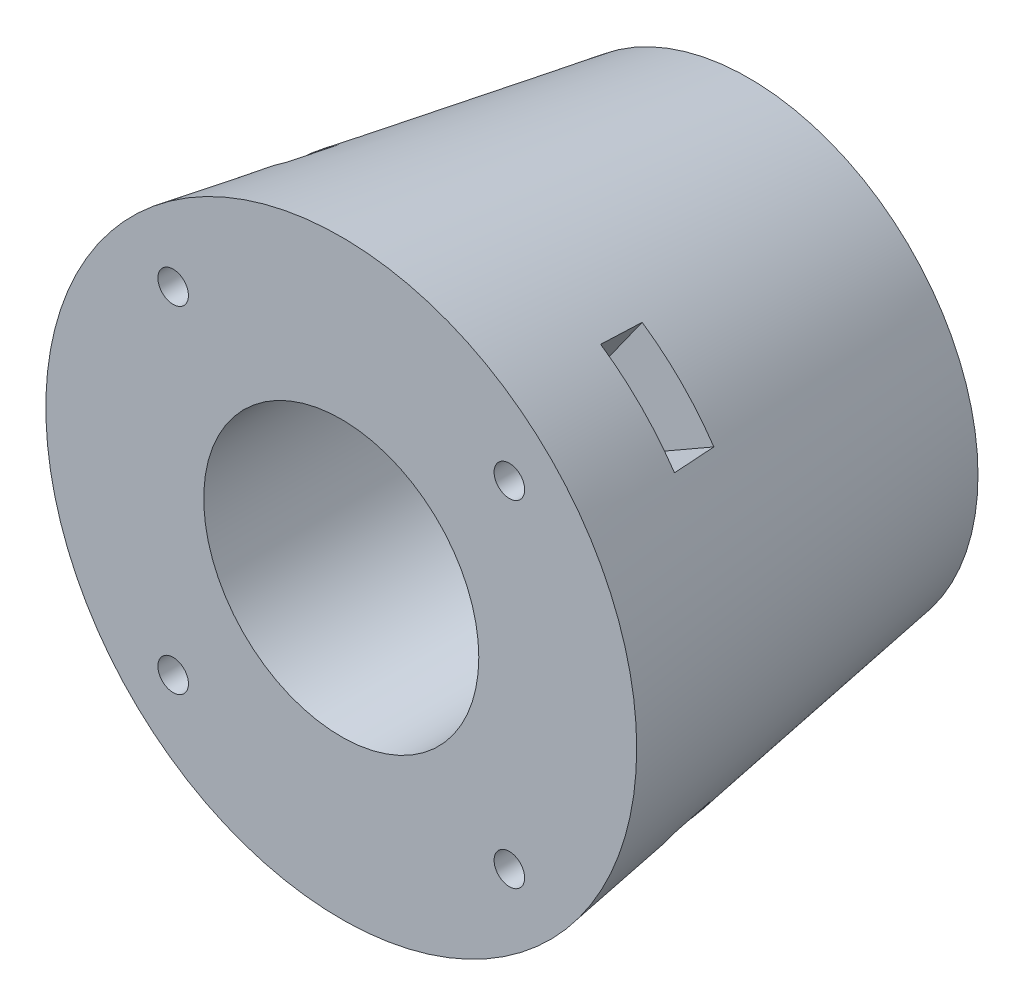
ISO-10303-21;
HEADER;
FILE_DESCRIPTION(('STEP AP214'),'2;1');
FILE_NAME('part.step','',(''),(''),'','','');
FILE_SCHEMA(('AUTOMOTIVE_DESIGN { 1 0 10303 214 1 1 1 1 }'));
ENDSEC;
DATA;
#1=APPLICATION_CONTEXT('core data for automotive mechanical design processes');
#2=APPLICATION_PROTOCOL_DEFINITION('international standard','automotive_design',2000,#1);
#3=PRODUCT_CONTEXT('',#1,'mechanical');
#4=PRODUCT('Part','Part','',(#3));
#5=PRODUCT_RELATED_PRODUCT_CATEGORY('part','',(#4));
#6=PRODUCT_DEFINITION_FORMATION('','',#4);
#7=PRODUCT_DEFINITION_CONTEXT('part definition',#1,'design');
#8=PRODUCT_DEFINITION('design','',#6,#7);
#9=PRODUCT_DEFINITION_SHAPE('','',#8);
#10=(LENGTH_UNIT() NAMED_UNIT(*) SI_UNIT(.MILLI.,.METRE.));
#11=(NAMED_UNIT(*) PLANE_ANGLE_UNIT() SI_UNIT($,.RADIAN.));
#12=(NAMED_UNIT(*) SI_UNIT($,.STERADIAN.) SOLID_ANGLE_UNIT());
#13=UNCERTAINTY_MEASURE_WITH_UNIT(LENGTH_MEASURE(1.E-05),#10,'distance_accuracy_value','');
#14=(GEOMETRIC_REPRESENTATION_CONTEXT(3) GLOBAL_UNCERTAINTY_ASSIGNED_CONTEXT((#13)) GLOBAL_UNIT_ASSIGNED_CONTEXT((#10,
#11,#12)) REPRESENTATION_CONTEXT('',''));
#15=CARTESIAN_POINT('',(0.,0.,0.));
#16=DIRECTION('',(0.,0.,1.));
#17=DIRECTION('',(1.,0.,0.));
#18=AXIS2_PLACEMENT_3D('',#15,#16,#17);
#19=CARTESIAN_POINT('',(0.,0.,0.));
#20=DIRECTION('',(0.,0.,1.));
#21=DIRECTION('',(1.,0.,0.));
#22=AXIS2_PLACEMENT_3D('',#19,#20,#21);
#23=CONICAL_SURFACE('',#22,29.,0.161093889959077);
#24=CARTESIAN_POINT('',(0.,0.,-14.5));
#25=DIRECTION('',(0.,0.,-1.));
#26=DIRECTION('',(-1.,0.,0.));
#27=AXIS2_PLACEMENT_3D('',#24,#25,#26);
#28=CIRCLE('',#27,26.6437204511795);
#29=CARTESIAN_POINT('',(14.9224643569327,-22.0727863441993,-14.5));
#30=VERTEX_POINT('',#29);
#31=CARTESIAN_POINT('',(21.9945592083481,-15.037526548973,-14.5));
#32=VERTEX_POINT('',#31);
#33=EDGE_CURVE('E11',#30,#32,#28,.F.);
#34=ORIENTED_EDGE('',*,*,#33,.F.);
#35=CARTESIAN_POINT('',(15.2873275589754,-22.7087847490646,-9.9998));
#36=CARTESIAN_POINT('',(15.2265185691146,-22.6027877059633,-10.7498680571058));
#37=CARTESIAN_POINT('',(15.1657074559639,-22.4967869617245,-11.4999354189919));
#38=CARTESIAN_POINT('',(15.044080983083,-22.2847780709715,-13.0000687523253));
#39=CARTESIAN_POINT('',(14.9832656233527,-22.1787699244574,-13.7501347237725));
#40=CARTESIAN_POINT('',(14.9224481403327,-22.0727580768057,-14.5002));
#41=B_SPLINE_CURVE_WITH_KNOTS('',3,(#35,#36,#37,#38,#39,#40),.UNSPECIFIED.,.F.,.F.,(4,2,4),(0.,
2.27987209502136,4.55974419004472),.UNSPECIFIED.);
#42=CARTESIAN_POINT('',(15.2873113447005,-22.7087564857238,-10.));
#43=VERTEX_POINT('',#42);
#44=EDGE_CURVE('E164',#43,#30,#41,.T.);
#45=ORIENTED_EDGE('',*,*,#44,.F.);
#46=CARTESIAN_POINT('',(0.,0.,-10.));
#47=DIRECTION('',(0.,0.,-1.));
#48=DIRECTION('',(-1.,0.,0.));
#49=AXIS2_PLACEMENT_3D('',#46,#47,#48);
#50=CIRCLE('',#49,27.3749796215031);
#51=CARTESIAN_POINT('',(22.5898708191227,-15.46244630235,-10.));
#52=VERTEX_POINT('',#51);
#53=EDGE_CURVE('E223',#43,#52,#50,.F.);
#54=ORIENTED_EDGE('',*,*,#53,.T.);
#55=CARTESIAN_POINT('',(21.9945327499099,-15.0375076635476,-14.5002));
#56=CARTESIAN_POINT('',(22.09376069182,-15.1083342892028,-13.7501334373089));
#57=CARTESIAN_POINT('',(22.1929883733889,-15.1791607290325,-13.0000668226301));
#58=CARTESIAN_POINT('',(22.3914432158443,-15.3208132370407,-11.4999334892967));
#59=CARTESIAN_POINT('',(22.4906703767307,-15.3916393052191,-10.7498667706423));
#60=CARTESIAN_POINT('',(22.5898972772759,-15.462465187572,-9.9998));
#61=B_SPLINE_CURVE_WITH_KNOTS('',3,(#55,#56,#57,#58,#59,#60),.UNSPECIFIED.,.F.,.F.,(4,2,4),(0.,
2.27972849138196,4.55945698276392),.UNSPECIFIED.);
#62=EDGE_CURVE('E43',#32,#52,#61,.T.);
#63=ORIENTED_EDGE('',*,*,#62,.F.);
#64=EDGE_LOOP('',(#34,#45,#54,#63));
#65=FACE_BOUND('',#64,.T.);
#66=CARTESIAN_POINT('',(0.,0.,-14.5));
#67=DIRECTION('',(0.,0.,-1.));
#68=DIRECTION('',(-1.,0.,0.));
#69=AXIS2_PLACEMENT_3D('',#66,#67,#68);
#70=CIRCLE('',#69,26.6437204511795);
#71=CARTESIAN_POINT('',(-22.0727863441994,-14.9224643569326,-14.5));
#72=VERTEX_POINT('',#71);
#73=CARTESIAN_POINT('',(-15.0375265489731,-21.9945592083481,-14.5));
#74=VERTEX_POINT('',#73);
#75=EDGE_CURVE('E391',#72,#74,#70,.F.);
#76=ORIENTED_EDGE('',*,*,#75,.F.);
#77=CARTESIAN_POINT('',(-22.7087847490646,-15.2873275589753,-9.9998));
#78=CARTESIAN_POINT('',(-22.6027877059634,-15.2265185691145,-10.7498680571058));
#79=CARTESIAN_POINT('',(-22.4967869617245,-15.1657074559638,-11.4999354189919));
#80=CARTESIAN_POINT('',(-22.2847780709716,-15.0440809830829,-13.0000687523253));
#81=CARTESIAN_POINT('',(-22.1787699244575,-14.9832656233526,-13.7501347237725));
#82=CARTESIAN_POINT('',(-22.0727580768057,-14.9224481403326,-14.5002));
#83=B_SPLINE_CURVE_WITH_KNOTS('',3,(#77,#78,#79,#80,#81,#82),.UNSPECIFIED.,.F.,.F.,(4,2,4),(0.,
2.27987209502136,4.55974419004472),.UNSPECIFIED.);
#84=CARTESIAN_POINT('',(-22.7087564857238,-15.2873113447004,-10.));
#85=VERTEX_POINT('',#84);
#86=EDGE_CURVE('E692',#85,#72,#83,.T.);
#87=ORIENTED_EDGE('',*,*,#86,.F.);
#88=CARTESIAN_POINT('',(0.,0.,-10.));
#89=DIRECTION('',(0.,0.,-1.));
#90=DIRECTION('',(-1.,0.,0.));
#91=AXIS2_PLACEMENT_3D('',#88,#89,#90);
#92=CIRCLE('',#91,27.3749796215031);
#93=CARTESIAN_POINT('',(-15.4624463023501,-22.5898708191227,-10.));
#94=VERTEX_POINT('',#93);
#95=EDGE_CURVE('E229',#85,#94,#92,.F.);
#96=ORIENTED_EDGE('',*,*,#95,.T.);
#97=CARTESIAN_POINT('',(-15.0375076635476,-21.9945327499098,-14.5002));
#98=CARTESIAN_POINT('',(-15.1083342892029,-22.09376069182,-13.7501334373089));
#99=CARTESIAN_POINT('',(-15.1791607290326,-22.1929883733889,-13.0000668226301));
#100=CARTESIAN_POINT('',(-15.3208132370407,-22.3914432158442,-11.4999334892967));
#101=CARTESIAN_POINT('',(-15.3916393052192,-22.4906703767307,-10.7498667706423));
#102=CARTESIAN_POINT('',(-15.4624651875721,-22.5898972772759,-9.9998));
#103=B_SPLINE_CURVE_WITH_KNOTS('',3,(#97,#98,#99,#100,#101,#102),.UNSPECIFIED.,.F.,.F.,(4,2,4),
(0.,2.27972849138196,4.55945698276392),.UNSPECIFIED.);
#104=EDGE_CURVE('E698',#74,#94,#103,.T.);
#105=ORIENTED_EDGE('',*,*,#104,.F.);
#106=EDGE_LOOP('',(#76,#87,#96,#105));
#107=FACE_BOUND('',#106,.T.);
#108=CARTESIAN_POINT('',(0.,0.,-14.5));
#109=DIRECTION('',(0.,0.,-1.));
#110=DIRECTION('',(-1.,0.,0.));
#111=AXIS2_PLACEMENT_3D('',#108,#109,#110);
#112=CIRCLE('',#111,26.6437204511795);
#113=CARTESIAN_POINT('',(-14.9224643569326,22.0727863441995,-14.5));
#114=VERTEX_POINT('',#113);
#115=CARTESIAN_POINT('',(-21.994559208348,15.0375265489732,-14.5));
#116=VERTEX_POINT('',#115);
#117=EDGE_CURVE('E396',#114,#116,#112,.F.);
#118=ORIENTED_EDGE('',*,*,#117,.F.);
#119=CARTESIAN_POINT('',(-15.2873275589753,22.7087847490647,-9.9998));
#120=CARTESIAN_POINT('',(-15.2265185691144,22.6027877059634,-10.7498680571058));
#121=CARTESIAN_POINT('',(-15.1657074559638,22.4967869617246,-11.4999354189919));
#122=CARTESIAN_POINT('',(-15.0440809830828,22.2847780709716,-13.0000687523253));
#123=CARTESIAN_POINT('',(-14.9832656233526,22.1787699244575,-13.7501347237725));
#124=CARTESIAN_POINT('',(-14.9224481403325,22.0727580768058,-14.5002));
#125=B_SPLINE_CURVE_WITH_KNOTS('',3,(#119,#120,#121,#122,#123,#124),.UNSPECIFIED.,.F.,.F.,(4,2,
4),(0.,2.27987209502136,4.55974419004472),.UNSPECIFIED.);
#126=CARTESIAN_POINT('',(-15.2873113447003,22.7087564857239,-10.));
#127=VERTEX_POINT('',#126);
#128=EDGE_CURVE('E410',#127,#114,#125,.T.);
#129=ORIENTED_EDGE('',*,*,#128,.F.);
#130=CARTESIAN_POINT('',(0.,0.,-10.));
#131=DIRECTION('',(0.,0.,-1.));
#132=DIRECTION('',(-1.,0.,0.));
#133=AXIS2_PLACEMENT_3D('',#130,#131,#132);
#134=CIRCLE('',#133,27.3749796215031);
#135=CARTESIAN_POINT('',(-22.5898708191226,15.4624463023502,-10.));
#136=VERTEX_POINT('',#135);
#137=EDGE_CURVE('E235',#127,#136,#134,.F.);
#138=ORIENTED_EDGE('',*,*,#137,.T.);
#139=CARTESIAN_POINT('',(-21.9945327499098,15.0375076635477,-14.5002));
#140=CARTESIAN_POINT('',(-22.0937606918199,15.108334289203,-13.7501334373089));
#141=CARTESIAN_POINT('',(-22.1929883733888,15.1791607290327,-13.0000668226301));
#142=CARTESIAN_POINT('',(-22.3914432158442,15.3208132370408,-11.4999334892967));
#143=CARTESIAN_POINT('',(-22.4906703767306,15.3916393052193,-10.7498667706423));
#144=CARTESIAN_POINT('',(-22.5898972772758,15.4624651875722,-9.9998));
#145=B_SPLINE_CURVE_WITH_KNOTS('',3,(#139,#140,#141,#142,#143,#144),.UNSPECIFIED.,.F.,.F.,(4,2,
4),(0.,2.27972849138196,4.55945698276392),.UNSPECIFIED.);
#146=EDGE_CURVE('E411',#116,#136,#145,.T.);
#147=ORIENTED_EDGE('',*,*,#146,.F.);
#148=EDGE_LOOP('',(#118,#129,#138,#147));
#149=FACE_BOUND('',#148,.T.);
#150=CARTESIAN_POINT('',(0.,0.,-14.5));
#151=DIRECTION('',(0.,0.,-1.));
#152=DIRECTION('',(-1.,0.,0.));
#153=AXIS2_PLACEMENT_3D('',#150,#151,#152);
#154=CIRCLE('',#153,26.6437204511795);
#155=CARTESIAN_POINT('',(22.0727863441993,14.9224643569328,-14.5));
#156=VERTEX_POINT('',#155);
#157=CARTESIAN_POINT('',(15.037526548973,21.9945592083482,-14.5));
#158=VERTEX_POINT('',#157);
#159=EDGE_CURVE('E401',#156,#158,#154,.F.);
#160=ORIENTED_EDGE('',*,*,#159,.F.);
#161=CARTESIAN_POINT('',(22.7087847490645,15.2873275589755,-9.9998));
#162=CARTESIAN_POINT('',(22.6027877059633,15.2265185691146,-10.7498680571058));
#163=CARTESIAN_POINT('',(22.4967869617244,15.165707455964,-11.4999354189919));
#164=CARTESIAN_POINT('',(22.2847780709715,15.0440809830831,-13.0000687523253));
#165=CARTESIAN_POINT('',(22.1787699244574,14.9832656233528,-13.7501347237725));
#166=CARTESIAN_POINT('',(22.0727580768056,14.9224481403327,-14.5002));
#167=B_SPLINE_CURVE_WITH_KNOTS('',3,(#161,#162,#163,#164,#165,#166),.UNSPECIFIED.,.F.,.F.,(4,2,
4),(0.,2.27987209502136,4.55974419004472),.UNSPECIFIED.);
#168=CARTESIAN_POINT('',(22.7087564857237,15.2873113447005,-10.));
#169=VERTEX_POINT('',#168);
#170=EDGE_CURVE('E307',#169,#156,#167,.T.);
#171=ORIENTED_EDGE('',*,*,#170,.F.);
#172=CARTESIAN_POINT('',(0.,0.,-10.));
#173=DIRECTION('',(0.,0.,-1.));
#174=DIRECTION('',(-1.,0.,0.));
#175=AXIS2_PLACEMENT_3D('',#172,#173,#174);
#176=CIRCLE('',#175,27.3749796215031);
#177=CARTESIAN_POINT('',(15.4624463023499,22.5898708191228,-10.));
#178=VERTEX_POINT('',#177);
#179=EDGE_CURVE('E262',#169,#178,#176,.F.);
#180=ORIENTED_EDGE('',*,*,#179,.T.);
#181=CARTESIAN_POINT('',(15.0375076635475,21.9945327499099,-14.5002));
#182=CARTESIAN_POINT('',(15.1083342892028,22.0937606918201,-13.7501334373089));
#183=CARTESIAN_POINT('',(15.1791607290324,22.192988373389,-13.0000668226301));
#184=CARTESIAN_POINT('',(15.3208132370406,22.3914432158444,-11.4999334892967));
#185=CARTESIAN_POINT('',(15.3916393052191,22.4906703767308,-10.7498667706423));
#186=CARTESIAN_POINT('',(15.4624651875719,22.589897277276,-9.9998));
#187=B_SPLINE_CURVE_WITH_KNOTS('',3,(#181,#182,#183,#184,#185,#186),.UNSPECIFIED.,.F.,.F.,(4,2,
4),(0.,2.27972849138196,4.55945698276392),.UNSPECIFIED.);
#188=EDGE_CURVE('E314',#158,#178,#187,.T.);
#189=ORIENTED_EDGE('',*,*,#188,.F.);
#190=EDGE_LOOP('',(#160,#171,#180,#189));
#191=FACE_BOUND('',#190,.T.);
#192=CARTESIAN_POINT('',(0.,0.,-40.));
#193=DIRECTION('',(0.,0.,1.));
#194=DIRECTION('',(1.,0.,0.));
#195=AXIS2_PLACEMENT_3D('',#192,#193,#194);
#196=CIRCLE('',#195,22.4999184860124);
#197=CARTESIAN_POINT('',(22.4999184860124,0.,-40.));
#198=VERTEX_POINT('',#197);
#199=EDGE_CURVE('E304',#198,#198,#196,.T.);
#200=ORIENTED_EDGE('',*,*,#199,.T.);
#201=EDGE_LOOP('',(#200));
#202=FACE_BOUND('',#201,.T.);
#203=CARTESIAN_POINT('',(0.,0.,0.));
#204=DIRECTION('',(0.,0.,1.));
#205=DIRECTION('',(1.,0.,0.));
#206=AXIS2_PLACEMENT_3D('',#203,#204,#205);
#207=CIRCLE('',#206,29.);
#208=CARTESIAN_POINT('',(29.,0.,0.));
#209=VERTEX_POINT('',#208);
#210=EDGE_CURVE('E301',#209,#209,#207,.T.);
#211=ORIENTED_EDGE('',*,*,#210,.F.);
#212=EDGE_LOOP('',(#211));
#213=FACE_BOUND('',#212,.T.);
#214=ADVANCED_FACE('F35',(#65,#107,#149,#191,#202,#213),#23,.T.);
#215=CARTESIAN_POINT('',(0.,0.,-40.));
#216=DIRECTION('',(0.,0.,1.));
#217=DIRECTION('',(1.,0.,0.));
#218=AXIS2_PLACEMENT_3D('',#215,#216,#217);
#219=PLANE('',#218);
#220=CARTESIAN_POINT('',(-3.50000000000003,-6.06217782649106,-40.));
#221=DIRECTION('',(0.,0.,1.));
#222=DIRECTION('',(1.,0.,0.));
#223=AXIS2_PLACEMENT_3D('',#220,#221,#222);
#224=CIRCLE('',#223,1.6);
#225=CARTESIAN_POINT('',(-1.90000000000003,-6.06217782649106,-40.));
#226=VERTEX_POINT('',#225);
#227=EDGE_CURVE('E274',#226,#226,#224,.T.);
#228=ORIENTED_EDGE('',*,*,#227,.T.);
#229=EDGE_LOOP('',(#228));
#230=FACE_BOUND('',#229,.T.);
#231=CARTESIAN_POINT('',(-3.49999999999994,6.06217782649111,-40.));
#232=DIRECTION('',(0.,0.,1.));
#233=DIRECTION('',(1.,0.,0.));
#234=AXIS2_PLACEMENT_3D('',#231,#232,#233);
#235=CIRCLE('',#234,1.6);
#236=CARTESIAN_POINT('',(-1.89999999999994,6.06217782649111,-40.));
#237=VERTEX_POINT('',#236);
#238=EDGE_CURVE('E269',#237,#237,#235,.T.);
#239=ORIENTED_EDGE('',*,*,#238,.T.);
#240=EDGE_LOOP('',(#239));
#241=FACE_BOUND('',#240,.T.);
#242=CARTESIAN_POINT('',(7.,0.,-40.));
#243=DIRECTION('',(0.,0.,1.));
#244=DIRECTION('',(1.,0.,0.));
#245=AXIS2_PLACEMENT_3D('',#242,#243,#244);
#246=CIRCLE('',#245,1.6);
#247=CARTESIAN_POINT('',(8.6,0.,-40.));
#248=VERTEX_POINT('',#247);
#249=EDGE_CURVE('E280',#248,#248,#246,.T.);
#250=ORIENTED_EDGE('',*,*,#249,.T.);
#251=EDGE_LOOP('',(#250));
#252=FACE_BOUND('',#251,.T.);
#253=ORIENTED_EDGE('',*,*,#199,.F.);
#254=EDGE_LOOP('',(#253));
#255=FACE_BOUND('',#254,.T.);
#256=ADVANCED_FACE('F372',(#230,#241,#252,#255),#219,.F.);
#257=CARTESIAN_POINT('',(0.,0.,0.));
#258=DIRECTION('',(0.,0.,1.));
#259=DIRECTION('',(1.,0.,0.));
#260=AXIS2_PLACEMENT_3D('',#257,#258,#259);
#261=PLANE('',#260);
#262=CARTESIAN_POINT('',(0.,0.,0.));
#263=DIRECTION('',(0.,0.,1.));
#264=DIRECTION('',(1.,0.,0.));
#265=AXIS2_PLACEMENT_3D('',#262,#263,#264);
#266=CIRCLE('',#265,13.5);
#267=CARTESIAN_POINT('',(13.5,0.,0.));
#268=VERTEX_POINT('',#267);
#269=EDGE_CURVE('E283',#268,#268,#266,.T.);
#270=ORIENTED_EDGE('',*,*,#269,.F.);
#271=EDGE_LOOP('',(#270));
#272=FACE_BOUND('',#271,.T.);
#273=CARTESIAN_POINT('',(16.5,16.5,0.));
#274=DIRECTION('',(0.,0.,1.));
#275=DIRECTION('',(-1.,0.,0.));
#276=AXIS2_PLACEMENT_3D('',#273,#274,#275);
#277=CIRCLE('',#276,1.5);
#278=CARTESIAN_POINT('',(15.,16.5,0.));
#279=VERTEX_POINT('',#278);
#280=EDGE_CURVE('E290',#279,#279,#277,.T.);
#281=ORIENTED_EDGE('',*,*,#280,.F.);
#282=EDGE_LOOP('',(#281));
#283=FACE_BOUND('',#282,.T.);
#284=CARTESIAN_POINT('',(16.5,-16.5,0.));
#285=DIRECTION('',(0.,0.,1.));
#286=DIRECTION('',(1.,0.,0.));
#287=AXIS2_PLACEMENT_3D('',#284,#285,#286);
#288=CIRCLE('',#287,1.5);
#289=CARTESIAN_POINT('',(18.,-16.5,0.));
#290=VERTEX_POINT('',#289);
#291=EDGE_CURVE('E294',#290,#290,#288,.T.);
#292=ORIENTED_EDGE('',*,*,#291,.F.);
#293=EDGE_LOOP('',(#292));
#294=FACE_BOUND('',#293,.T.);
#295=CARTESIAN_POINT('',(-16.5,-16.5,0.));
#296=DIRECTION('',(0.,0.,1.));
#297=DIRECTION('',(-1.,0.,0.));
#298=AXIS2_PLACEMENT_3D('',#295,#296,#297);
#299=CIRCLE('',#298,1.5);
#300=CARTESIAN_POINT('',(-18.,-16.5,0.));
#301=VERTEX_POINT('',#300);
#302=EDGE_CURVE('E287',#301,#301,#299,.T.);
#303=ORIENTED_EDGE('',*,*,#302,.F.);
#304=EDGE_LOOP('',(#303));
#305=FACE_BOUND('',#304,.T.);
#306=CARTESIAN_POINT('',(-16.5,16.5,0.));
#307=DIRECTION('',(0.,0.,1.));
#308=DIRECTION('',(1.,0.,0.));
#309=AXIS2_PLACEMENT_3D('',#306,#307,#308);
#310=CIRCLE('',#309,1.5);
#311=CARTESIAN_POINT('',(-15.,16.5,0.));
#312=VERTEX_POINT('',#311);
#313=EDGE_CURVE('E293',#312,#312,#310,.T.);
#314=ORIENTED_EDGE('',*,*,#313,.F.);
#315=EDGE_LOOP('',(#314));
#316=FACE_BOUND('',#315,.T.);
#317=ORIENTED_EDGE('',*,*,#210,.T.);
#318=EDGE_LOOP('',(#317));
#319=FACE_BOUND('',#318,.T.);
#320=ADVANCED_FACE('F370',(#272,#283,#294,#305,#316,#319),#261,.T.);
#321=CARTESIAN_POINT('',(-16.5,16.5,-10.));
#322=DIRECTION('',(0.,0.,1.));
#323=DIRECTION('',(1.,0.,0.));
#324=AXIS2_PLACEMENT_3D('',#321,#322,#323);
#325=CYLINDRICAL_SURFACE('',#324,1.5);
#326=CARTESIAN_POINT('',(-16.5,16.5,-10.));
#327=DIRECTION('',(0.,0.,-1.));
#328=DIRECTION('',(-1.,0.,0.));
#329=AXIS2_PLACEMENT_3D('',#326,#327,#328);
#330=CIRCLE('',#329,1.5);
#331=CARTESIAN_POINT('',(-18.,16.5,-10.));
#332=VERTEX_POINT('',#331);
#333=EDGE_CURVE('E232',#332,#332,#330,.F.);
#334=ORIENTED_EDGE('',*,*,#333,.F.);
#335=EDGE_LOOP('',(#334));
#336=FACE_BOUND('',#335,.T.);
#337=ORIENTED_EDGE('',*,*,#313,.T.);
#338=EDGE_LOOP('',(#337));
#339=FACE_BOUND('',#338,.T.);
#340=ADVANCED_FACE('F366',(#336,#339),#325,.F.);
#341=CARTESIAN_POINT('',(-16.5,-16.5,-10.));
#342=DIRECTION('',(0.,0.,1.));
#343=DIRECTION('',(1.,0.,0.));
#344=AXIS2_PLACEMENT_3D('',#341,#342,#343);
#345=CYLINDRICAL_SURFACE('',#344,1.5);
#346=CARTESIAN_POINT('',(-16.5,-16.5,-10.));
#347=DIRECTION('',(0.,0.,-1.));
#348=DIRECTION('',(-1.,0.,0.));
#349=AXIS2_PLACEMENT_3D('',#346,#347,#348);
#350=CIRCLE('',#349,1.5);
#351=CARTESIAN_POINT('',(-18.,-16.5,-10.));
#352=VERTEX_POINT('',#351);
#353=EDGE_CURVE('E226',#352,#352,#350,.F.);
#354=ORIENTED_EDGE('',*,*,#353,.F.);
#355=EDGE_LOOP('',(#354));
#356=FACE_BOUND('',#355,.T.);
#357=ORIENTED_EDGE('',*,*,#302,.T.);
#358=EDGE_LOOP('',(#357));
#359=FACE_BOUND('',#358,.T.);
#360=ADVANCED_FACE('F362',(#356,#359),#345,.F.);
#361=CARTESIAN_POINT('',(16.5,-16.5,-10.));
#362=DIRECTION('',(0.,0.,1.));
#363=DIRECTION('',(1.,0.,0.));
#364=AXIS2_PLACEMENT_3D('',#361,#362,#363);
#365=CYLINDRICAL_SURFACE('',#364,1.5);
#366=CARTESIAN_POINT('',(16.5,-16.5,-10.));
#367=DIRECTION('',(0.,0.,-1.));
#368=DIRECTION('',(-1.,0.,0.));
#369=AXIS2_PLACEMENT_3D('',#366,#367,#368);
#370=CIRCLE('',#369,1.5);
#371=CARTESIAN_POINT('',(15.,-16.5,-10.));
#372=VERTEX_POINT('',#371);
#373=EDGE_CURVE('E179',#372,#372,#370,.F.);
#374=ORIENTED_EDGE('',*,*,#373,.F.);
#375=EDGE_LOOP('',(#374));
#376=FACE_BOUND('',#375,.T.);
#377=ORIENTED_EDGE('',*,*,#291,.T.);
#378=EDGE_LOOP('',(#377));
#379=FACE_BOUND('',#378,.T.);
#380=ADVANCED_FACE('F358',(#376,#379),#365,.F.);
#381=CARTESIAN_POINT('',(16.5,16.5,-10.));
#382=DIRECTION('',(0.,0.,1.));
#383=DIRECTION('',(1.,0.,0.));
#384=AXIS2_PLACEMENT_3D('',#381,#382,#383);
#385=CYLINDRICAL_SURFACE('',#384,1.5);
#386=CARTESIAN_POINT('',(16.5,16.5,-10.));
#387=DIRECTION('',(0.,0.,-1.));
#388=DIRECTION('',(-1.,0.,0.));
#389=AXIS2_PLACEMENT_3D('',#386,#387,#388);
#390=CIRCLE('',#389,1.5);
#391=CARTESIAN_POINT('',(15.,16.5,-10.));
#392=VERTEX_POINT('',#391);
#393=EDGE_CURVE('E258',#392,#392,#390,.F.);
#394=ORIENTED_EDGE('',*,*,#393,.F.);
#395=EDGE_LOOP('',(#394));
#396=FACE_BOUND('',#395,.T.);
#397=ORIENTED_EDGE('',*,*,#280,.T.);
#398=EDGE_LOOP('',(#397));
#399=FACE_BOUND('',#398,.T.);
#400=ADVANCED_FACE('F354',(#396,#399),#385,.F.);
#401=CARTESIAN_POINT('',(0.,0.,-35.));
#402=DIRECTION('',(0.,0.,1.));
#403=DIRECTION('',(1.,0.,0.));
#404=AXIS2_PLACEMENT_3D('',#401,#402,#403);
#405=CYLINDRICAL_SURFACE('',#404,13.5);
#406=CARTESIAN_POINT('',(0.,0.,-35.));
#407=DIRECTION('',(0.,0.,1.));
#408=DIRECTION('',(1.,0.,0.));
#409=AXIS2_PLACEMENT_3D('',#406,#407,#408);
#410=CIRCLE('',#409,13.5);
#411=CARTESIAN_POINT('',(13.5,0.,-35.));
#412=VERTEX_POINT('',#411);
#413=EDGE_CURVE('E284',#412,#412,#410,.T.);
#414=ORIENTED_EDGE('',*,*,#413,.F.);
#415=EDGE_LOOP('',(#414));
#416=FACE_BOUND('',#415,.T.);
#417=ORIENTED_EDGE('',*,*,#269,.T.);
#418=EDGE_LOOP('',(#417));
#419=FACE_BOUND('',#418,.T.);
#420=ADVANCED_FACE('F350',(#416,#419),#405,.F.);
#421=CARTESIAN_POINT('',(0.,0.,-35.));
#422=DIRECTION('',(0.,0.,1.));
#423=DIRECTION('',(1.,0.,0.));
#424=AXIS2_PLACEMENT_3D('',#421,#422,#423);
#425=PLANE('',#424);
#426=CARTESIAN_POINT('',(-3.50000000000003,-6.06217782649106,-35.));
#427=DIRECTION('',(0.,0.,1.));
#428=DIRECTION('',(1.,0.,0.));
#429=AXIS2_PLACEMENT_3D('',#426,#427,#428);
#430=CIRCLE('',#429,1.6);
#431=CARTESIAN_POINT('',(-1.90000000000003,-6.06217782649106,-35.));
#432=VERTEX_POINT('',#431);
#433=EDGE_CURVE('E266',#432,#432,#430,.T.);
#434=ORIENTED_EDGE('',*,*,#433,.F.);
#435=EDGE_LOOP('',(#434));
#436=FACE_BOUND('',#435,.T.);
#437=CARTESIAN_POINT('',(-3.49999999999994,6.06217782649111,-35.));
#438=DIRECTION('',(0.,0.,1.));
#439=DIRECTION('',(1.,0.,0.));
#440=AXIS2_PLACEMENT_3D('',#437,#438,#439);
#441=CIRCLE('',#440,1.6);
#442=CARTESIAN_POINT('',(-1.89999999999994,6.06217782649111,-35.));
#443=VERTEX_POINT('',#442);
#444=EDGE_CURVE('E265',#443,#443,#441,.T.);
#445=ORIENTED_EDGE('',*,*,#444,.F.);
#446=EDGE_LOOP('',(#445));
#447=FACE_BOUND('',#446,.T.);
#448=CARTESIAN_POINT('',(7.,0.,-35.));
#449=DIRECTION('',(0.,0.,1.));
#450=DIRECTION('',(1.,0.,0.));
#451=AXIS2_PLACEMENT_3D('',#448,#449,#450);
#452=CIRCLE('',#451,1.6);
#453=CARTESIAN_POINT('',(8.6,0.,-35.));
#454=VERTEX_POINT('',#453);
#455=EDGE_CURVE('E277',#454,#454,#452,.T.);
#456=ORIENTED_EDGE('',*,*,#455,.F.);
#457=EDGE_LOOP('',(#456));
#458=FACE_BOUND('',#457,.T.);
#459=ORIENTED_EDGE('',*,*,#413,.T.);
#460=EDGE_LOOP('',(#459));
#461=FACE_BOUND('',#460,.T.);
#462=ADVANCED_FACE('F346',(#436,#447,#458,#461),#425,.T.);
#463=CARTESIAN_POINT('',(7.,0.,-70.));
#464=DIRECTION('',(0.,0.,1.));
#465=DIRECTION('',(1.,0.,0.));
#466=AXIS2_PLACEMENT_3D('',#463,#464,#465);
#467=CYLINDRICAL_SURFACE('',#466,1.6);
#468=ORIENTED_EDGE('',*,*,#455,.T.);
#469=EDGE_LOOP('',(#468));
#470=FACE_BOUND('',#469,.T.);
#471=ORIENTED_EDGE('',*,*,#249,.F.);
#472=EDGE_LOOP('',(#471));
#473=FACE_BOUND('',#472,.T.);
#474=ADVANCED_FACE('F342',(#470,#473),#467,.F.);
#475=CARTESIAN_POINT('',(-3.49999999999994,6.06217782649111,-70.));
#476=DIRECTION('',(0.,0.,1.));
#477=DIRECTION('',(1.,0.,0.));
#478=AXIS2_PLACEMENT_3D('',#475,#476,#477);
#479=CYLINDRICAL_SURFACE('',#478,1.6);
#480=ORIENTED_EDGE('',*,*,#444,.T.);
#481=EDGE_LOOP('',(#480));
#482=FACE_BOUND('',#481,.T.);
#483=ORIENTED_EDGE('',*,*,#238,.F.);
#484=EDGE_LOOP('',(#483));
#485=FACE_BOUND('',#484,.T.);
#486=ADVANCED_FACE('F338',(#482,#485),#479,.F.);
#487=CARTESIAN_POINT('',(-3.50000000000003,-6.06217782649106,-70.));
#488=DIRECTION('',(0.,0.,1.));
#489=DIRECTION('',(1.,0.,0.));
#490=AXIS2_PLACEMENT_3D('',#487,#488,#489);
#491=CYLINDRICAL_SURFACE('',#490,1.6);
#492=ORIENTED_EDGE('',*,*,#433,.T.);
#493=EDGE_LOOP('',(#492));
#494=FACE_BOUND('',#493,.T.);
#495=ORIENTED_EDGE('',*,*,#227,.F.);
#496=EDGE_LOOP('',(#495));
#497=FACE_BOUND('',#496,.T.);
#498=ADVANCED_FACE('F335',(#494,#497),#491,.F.);
#499=CARTESIAN_POINT('',(0.,0.,-10.));
#500=DIRECTION('',(0.,0.,-1.));
#501=DIRECTION('',(-1.,0.,0.));
#502=AXIS2_PLACEMENT_3D('',#499,#500,#501);
#503=PLANE('',#502);
#504=DIRECTION('',(0.867398507756194,0.497614136397197,0.));
#505=VECTOR('',#504,1.);
#506=CARTESIAN_POINT('',(17.027183550772,12.0278740916699,-10.));
#507=LINE('',#506,#505);
#508=CARTESIAN_POINT('',(17.027183550772,12.0278740916699,-10.));
#509=VERTEX_POINT('',#508);
#510=EDGE_CURVE('E251',#509,#169,#507,.T.);
#511=ORIENTED_EDGE('',*,*,#510,.F.);
#512=CARTESIAN_POINT('',(0.,0.,-10.));
#513=DIRECTION('',(0.,0.,-1.));
#514=DIRECTION('',(-1.,0.,0.));
#515=AXIS2_PLACEMENT_3D('',#512,#513,#514);
#516=CIRCLE('',#515,20.8469358620576);
#517=CARTESIAN_POINT('',(11.6689236989239,17.2751542553296,-10.));
#518=VERTEX_POINT('',#517);
#519=EDGE_CURVE('E238',#518,#509,#516,.T.);
#520=ORIENTED_EDGE('',*,*,#519,.F.);
#521=DIRECTION('',(-0.580964003653115,-0.813929251507367,0.));
#522=VECTOR('',#521,1.);
#523=CARTESIAN_POINT('',(11.6689236989239,17.2751542553296,-10.));
#524=LINE('',#523,#522);
#525=EDGE_CURVE('E243',#178,#518,#524,.T.);
#526=ORIENTED_EDGE('',*,*,#525,.F.);
#527=ORIENTED_EDGE('',*,*,#179,.F.);
#528=EDGE_LOOP('',(#511,#520,#526,#527));
#529=FACE_BOUND('',#528,.T.);
#530=ORIENTED_EDGE('',*,*,#393,.T.);
#531=EDGE_LOOP('',(#530));
#532=FACE_BOUND('',#531,.T.);
#533=ADVANCED_FACE('F333',(#529,#532),#503,.T.);
#534=CARTESIAN_POINT('',(0.,0.,-14.5));
#535=DIRECTION('',(0.,0.,1.));
#536=DIRECTION('',(1.,0.,0.));
#537=AXIS2_PLACEMENT_3D('',#534,#535,#536);
#538=CYLINDRICAL_SURFACE('',#537,20.8469358620576);
#539=ORIENTED_EDGE('',*,*,#519,.T.);
#540=DIRECTION('',(0.,0.,1.));
#541=VECTOR('',#540,1.);
#542=CARTESIAN_POINT('',(17.027183550772,12.0278740916699,-14.5));
#543=LINE('',#542,#541);
#544=CARTESIAN_POINT('',(17.027183550772,12.0278740916699,-14.5));
#545=VERTEX_POINT('',#544);
#546=EDGE_CURVE('E248',#545,#509,#543,.T.);
#547=ORIENTED_EDGE('',*,*,#546,.F.);
#548=CARTESIAN_POINT('',(0.,0.,-14.5));
#549=DIRECTION('',(0.,0.,-1.));
#550=DIRECTION('',(-1.,0.,0.));
#551=AXIS2_PLACEMENT_3D('',#548,#549,#550);
#552=CIRCLE('',#551,20.8469358620576);
#553=CARTESIAN_POINT('',(11.6689236989239,17.2751542553296,-14.5));
#554=VERTEX_POINT('',#553);
#555=EDGE_CURVE('E239',#554,#545,#552,.T.);
#556=ORIENTED_EDGE('',*,*,#555,.F.);
#557=DIRECTION('',(0.,0.,1.));
#558=VECTOR('',#557,1.);
#559=CARTESIAN_POINT('',(11.6689236989239,17.2751542553296,-14.5));
#560=LINE('',#559,#558);
#561=EDGE_CURVE('E255',#554,#518,#560,.T.);
#562=ORIENTED_EDGE('',*,*,#561,.T.);
#563=EDGE_LOOP('',(#539,#547,#556,#562));
#564=FACE_BOUND('',#563,.T.);
#565=ADVANCED_FACE('F330',(#564),#538,.T.);
#566=CARTESIAN_POINT('',(11.6689236989239,17.2751542553296,-14.5));
#567=DIRECTION('',(-0.813929251507367,0.580964003653115,0.));
#568=DIRECTION('',(-0.580964003653116,-0.813929251507367,0.));
#569=AXIS2_PLACEMENT_3D('',#566,#567,#568);
#570=PLANE('',#569);
#571=ORIENTED_EDGE('',*,*,#188,.T.);
#572=ORIENTED_EDGE('',*,*,#525,.T.);
#573=ORIENTED_EDGE('',*,*,#561,.F.);
#574=DIRECTION('',(-0.580964003653115,-0.813929251507367,0.));
#575=VECTOR('',#574,1.);
#576=CARTESIAN_POINT('',(11.6689236989239,17.2751542553296,-14.5));
#577=LINE('',#576,#575);
#578=EDGE_CURVE('E246',#158,#554,#577,.T.);
#579=ORIENTED_EDGE('',*,*,#578,.F.);
#580=EDGE_LOOP('',(#571,#572,#573,#579));
#581=FACE_BOUND('',#580,.T.);
#582=ADVANCED_FACE('F326',(#581),#570,.F.);
#583=CARTESIAN_POINT('',(17.027183550772,12.0278740916699,-14.5));
#584=DIRECTION('',(0.497614136397197,-0.867398507756194,0.));
#585=DIRECTION('',(0.867398507756194,0.497614136397197,0.));
#586=AXIS2_PLACEMENT_3D('',#583,#584,#585);
#587=PLANE('',#586);
#588=ORIENTED_EDGE('',*,*,#170,.T.);
#589=DIRECTION('',(0.867398507756194,0.497614136397197,0.));
#590=VECTOR('',#589,1.);
#591=CARTESIAN_POINT('',(17.027183550772,12.0278740916699,-14.5));
#592=LINE('',#591,#590);
#593=EDGE_CURVE('E242',#545,#156,#592,.T.);
#594=ORIENTED_EDGE('',*,*,#593,.F.);
#595=ORIENTED_EDGE('',*,*,#546,.T.);
#596=ORIENTED_EDGE('',*,*,#510,.T.);
#597=EDGE_LOOP('',(#588,#594,#595,#596));
#598=FACE_BOUND('',#597,.T.);
#599=ADVANCED_FACE('F321',(#598),#587,.F.);
#600=CARTESIAN_POINT('',(0.,0.,-14.5));
#601=DIRECTION('',(0.,0.,-1.));
#602=DIRECTION('',(-1.,0.,0.));
#603=AXIS2_PLACEMENT_3D('',#600,#601,#602);
#604=PLANE('',#603);
#605=ORIENTED_EDGE('',*,*,#159,.T.);
#606=ORIENTED_EDGE('',*,*,#578,.T.);
#607=ORIENTED_EDGE('',*,*,#555,.T.);
#608=ORIENTED_EDGE('',*,*,#593,.T.);
#609=EDGE_LOOP('',(#605,#606,#607,#608));
#610=FACE_BOUND('',#609,.T.);
#611=ADVANCED_FACE('F325',(#610),#604,.F.);
#612=CARTESIAN_POINT('',(0.,0.,-10.));
#613=DIRECTION('',(0.,0.,-1.));
#614=DIRECTION('',(-1.,0.,0.));
#615=AXIS2_PLACEMENT_3D('',#612,#613,#614);
#616=PLANE('',#615);
#617=DIRECTION('',(0.497614136397194,-0.867398507756195,0.));
#618=VECTOR('',#617,1.);
#619=CARTESIAN_POINT('',(12.0278740916698,-17.027183550772,-10.));
#620=LINE('',#619,#618);
#621=CARTESIAN_POINT('',(12.0278740916698,-17.027183550772,-10.));
#622=VERTEX_POINT('',#621);
#623=EDGE_CURVE('E172',#622,#43,#620,.T.);
#624=ORIENTED_EDGE('',*,*,#623,.F.);
#625=CARTESIAN_POINT('',(0.,0.,-10.));
#626=DIRECTION('',(0.,0.,-1.));
#627=DIRECTION('',(-1.,0.,0.));
#628=AXIS2_PLACEMENT_3D('',#625,#626,#627);
#629=CIRCLE('',#628,20.8469358620576);
#630=CARTESIAN_POINT('',(17.2751542553296,-11.668923698924,-10.));
#631=VERTEX_POINT('',#630);
#632=EDGE_CURVE('E153',#631,#622,#629,.T.);
#633=ORIENTED_EDGE('',*,*,#632,.F.);
#634=DIRECTION('',(-0.813929251507365,0.580964003653118,0.));
#635=VECTOR('',#634,1.);
#636=CARTESIAN_POINT('',(17.2751542553296,-11.668923698924,-10.));
#637=LINE('',#636,#635);
#638=EDGE_CURVE('E50',#52,#631,#637,.T.);
#639=ORIENTED_EDGE('',*,*,#638,.F.);
#640=ORIENTED_EDGE('',*,*,#53,.F.);
#641=EDGE_LOOP('',(#624,#633,#639,#640));
#642=FACE_BOUND('',#641,.T.);
#643=ORIENTED_EDGE('',*,*,#373,.T.);
#644=EDGE_LOOP('',(#643));
#645=FACE_BOUND('',#644,.T.);
#646=ADVANCED_FACE('F440',(#642,#645),#616,.T.);
#647=CARTESIAN_POINT('',(0.,0.,-14.5));
#648=DIRECTION('',(0.,0.,1.));
#649=DIRECTION('',(1.,0.,0.));
#650=AXIS2_PLACEMENT_3D('',#647,#648,#649);
#651=CYLINDRICAL_SURFACE('',#650,20.8469358620576);
#652=ORIENTED_EDGE('',*,*,#632,.T.);
#653=DIRECTION('',(0.,0.,1.));
#654=VECTOR('',#653,1.);
#655=CARTESIAN_POINT('',(12.0278740916698,-17.027183550772,-14.5));
#656=LINE('',#655,#654);
#657=CARTESIAN_POINT('',(12.0278740916698,-17.027183550772,-14.5));
#658=VERTEX_POINT('',#657);
#659=EDGE_CURVE('E147',#658,#622,#656,.T.);
#660=ORIENTED_EDGE('',*,*,#659,.F.);
#661=CARTESIAN_POINT('',(0.,0.,-14.5));
#662=DIRECTION('',(0.,0.,-1.));
#663=DIRECTION('',(-1.,0.,0.));
#664=AXIS2_PLACEMENT_3D('',#661,#662,#663);
#665=CIRCLE('',#664,20.8469358620576);
#666=CARTESIAN_POINT('',(17.2751542553296,-11.668923698924,-14.5));
#667=VERTEX_POINT('',#666);
#668=EDGE_CURVE('E152',#667,#658,#665,.T.);
#669=ORIENTED_EDGE('',*,*,#668,.F.);
#670=DIRECTION('',(0.,0.,1.));
#671=VECTOR('',#670,1.);
#672=CARTESIAN_POINT('',(17.2751542553296,-11.668923698924,-14.5));
#673=LINE('',#672,#671);
#674=EDGE_CURVE('E157',#667,#631,#673,.T.);
#675=ORIENTED_EDGE('',*,*,#674,.T.);
#676=EDGE_LOOP('',(#652,#660,#669,#675));
#677=FACE_BOUND('',#676,.T.);
#678=ADVANCED_FACE('F149',(#677),#651,.T.);
#679=CARTESIAN_POINT('',(17.2751542553296,-11.668923698924,-14.5));
#680=DIRECTION('',(0.580964003653118,0.813929251507365,0.));
#681=DIRECTION('',(-0.813929251507365,0.580964003653118,0.));
#682=AXIS2_PLACEMENT_3D('',#679,#680,#681);
#683=PLANE('',#682);
#684=ORIENTED_EDGE('',*,*,#62,.T.);
#685=ORIENTED_EDGE('',*,*,#638,.T.);
#686=ORIENTED_EDGE('',*,*,#674,.F.);
#687=DIRECTION('',(-0.813929251507365,0.580964003653118,0.));
#688=VECTOR('',#687,1.);
#689=CARTESIAN_POINT('',(17.2751542553296,-11.668923698924,-14.5));
#690=LINE('',#689,#688);
#691=EDGE_CURVE('E158',#32,#667,#690,.T.);
#692=ORIENTED_EDGE('',*,*,#691,.F.);
#693=EDGE_LOOP('',(#684,#685,#686,#692));
#694=FACE_BOUND('',#693,.T.);
#695=ADVANCED_FACE('F489',(#694),#683,.F.);
#696=CARTESIAN_POINT('',(12.0278740916698,-17.027183550772,-14.5));
#697=DIRECTION('',(-0.867398507756195,-0.497614136397195,0.));
#698=DIRECTION('',(0.497614136397195,-0.867398507756195,0.));
#699=AXIS2_PLACEMENT_3D('',#696,#697,#698);
#700=PLANE('',#699);
#701=ORIENTED_EDGE('',*,*,#44,.T.);
#702=DIRECTION('',(0.497614136397194,-0.867398507756195,0.));
#703=VECTOR('',#702,1.);
#704=CARTESIAN_POINT('',(12.0278740916698,-17.027183550772,-14.5));
#705=LINE('',#704,#703);
#706=EDGE_CURVE('E161',#658,#30,#705,.T.);
#707=ORIENTED_EDGE('',*,*,#706,.F.);
#708=ORIENTED_EDGE('',*,*,#659,.T.);
#709=ORIENTED_EDGE('',*,*,#623,.T.);
#710=EDGE_LOOP('',(#701,#707,#708,#709));
#711=FACE_BOUND('',#710,.T.);
#712=ADVANCED_FACE('F162',(#711),#700,.F.);
#713=CARTESIAN_POINT('',(0.,0.,-14.5));
#714=DIRECTION('',(0.,0.,-1.));
#715=DIRECTION('',(-1.,0.,0.));
#716=AXIS2_PLACEMENT_3D('',#713,#714,#715);
#717=PLANE('',#716);
#718=ORIENTED_EDGE('',*,*,#33,.T.);
#719=ORIENTED_EDGE('',*,*,#691,.T.);
#720=ORIENTED_EDGE('',*,*,#668,.T.);
#721=ORIENTED_EDGE('',*,*,#706,.T.);
#722=EDGE_LOOP('',(#718,#719,#720,#721));
#723=FACE_BOUND('',#722,.T.);
#724=ADVANCED_FACE('F168',(#723),#717,.F.);
#725=CARTESIAN_POINT('',(0.,0.,-10.));
#726=DIRECTION('',(0.,0.,-1.));
#727=DIRECTION('',(-1.,0.,0.));
#728=AXIS2_PLACEMENT_3D('',#725,#726,#727);
#729=PLANE('',#728);
#730=DIRECTION('',(-0.867398507756197,-0.497614136397191,0.));
#731=VECTOR('',#730,1.);
#732=CARTESIAN_POINT('',(-17.027183550772,-12.0278740916698,-10.));
#733=LINE('',#732,#731);
#734=CARTESIAN_POINT('',(-17.027183550772,-12.0278740916698,-10.));
#735=VERTEX_POINT('',#734);
#736=EDGE_CURVE('E193',#735,#85,#733,.T.);
#737=ORIENTED_EDGE('',*,*,#736,.F.);
#738=CARTESIAN_POINT('',(0.,0.,-10.));
#739=DIRECTION('',(0.,0.,-1.));
#740=DIRECTION('',(-1.,0.,0.));
#741=AXIS2_PLACEMENT_3D('',#738,#739,#740);
#742=CIRCLE('',#741,20.8469358620576);
#743=CARTESIAN_POINT('',(-11.6689236989241,-17.2751542553296,-10.));
#744=VERTEX_POINT('',#743);
#745=EDGE_CURVE('E190',#744,#735,#742,.T.);
#746=ORIENTED_EDGE('',*,*,#745,.F.);
#747=DIRECTION('',(0.580964003653121,0.813929251507363,0.));
#748=VECTOR('',#747,1.);
#749=CARTESIAN_POINT('',(-11.6689236989241,-17.2751542553296,-10.));
#750=LINE('',#749,#748);
#751=EDGE_CURVE('E58',#94,#744,#750,.T.);
#752=ORIENTED_EDGE('',*,*,#751,.F.);
#753=ORIENTED_EDGE('',*,*,#95,.F.);
#754=EDGE_LOOP('',(#737,#746,#752,#753));
#755=FACE_BOUND('',#754,.T.);
#756=ORIENTED_EDGE('',*,*,#353,.T.);
#757=EDGE_LOOP('',(#756));
#758=FACE_BOUND('',#757,.T.);
#759=ADVANCED_FACE('F509',(#755,#758),#729,.T.);
#760=CARTESIAN_POINT('',(0.,0.,-14.5));
#761=DIRECTION('',(0.,0.,1.));
#762=DIRECTION('',(1.,0.,0.));
#763=AXIS2_PLACEMENT_3D('',#760,#761,#762);
#764=CYLINDRICAL_SURFACE('',#763,20.8469358620576);
#765=ORIENTED_EDGE('',*,*,#745,.T.);
#766=DIRECTION('',(0.,0.,1.));
#767=VECTOR('',#766,1.);
#768=CARTESIAN_POINT('',(-17.027183550772,-12.0278740916698,-14.5));
#769=LINE('',#768,#767);
#770=CARTESIAN_POINT('',(-17.027183550772,-12.0278740916698,-14.5));
#771=VERTEX_POINT('',#770);
#772=EDGE_CURVE('E189',#771,#735,#769,.T.);
#773=ORIENTED_EDGE('',*,*,#772,.F.);
#774=CARTESIAN_POINT('',(0.,0.,-14.5));
#775=DIRECTION('',(0.,0.,-1.));
#776=DIRECTION('',(-1.,0.,0.));
#777=AXIS2_PLACEMENT_3D('',#774,#775,#776);
#778=CIRCLE('',#777,20.8469358620576);
#779=CARTESIAN_POINT('',(-11.6689236989241,-17.2751542553296,-14.5));
#780=VERTEX_POINT('',#779);
#781=EDGE_CURVE('E181',#780,#771,#778,.T.);
#782=ORIENTED_EDGE('',*,*,#781,.F.);
#783=DIRECTION('',(0.,0.,1.));
#784=VECTOR('',#783,1.);
#785=CARTESIAN_POINT('',(-11.6689236989241,-17.2751542553296,-14.5));
#786=LINE('',#785,#784);
#787=EDGE_CURVE('E177',#780,#744,#786,.T.);
#788=ORIENTED_EDGE('',*,*,#787,.T.);
#789=EDGE_LOOP('',(#765,#773,#782,#788));
#790=FACE_BOUND('',#789,.T.);
#791=ADVANCED_FACE('F516',(#790),#764,.T.);
#792=CARTESIAN_POINT('',(-11.6689236989241,-17.2751542553296,-14.5));
#793=DIRECTION('',(0.813929251507363,-0.580964003653121,0.));
#794=DIRECTION('',(0.580964003653121,0.813929251507363,0.));
#795=AXIS2_PLACEMENT_3D('',#792,#793,#794);
#796=PLANE('',#795);
#797=ORIENTED_EDGE('',*,*,#104,.T.);
#798=ORIENTED_EDGE('',*,*,#751,.T.);
#799=ORIENTED_EDGE('',*,*,#787,.F.);
#800=DIRECTION('',(0.580964003653121,0.813929251507363,0.));
#801=VECTOR('',#800,1.);
#802=CARTESIAN_POINT('',(-11.6689236989241,-17.2751542553296,-14.5));
#803=LINE('',#802,#801);
#804=EDGE_CURVE('E187',#74,#780,#803,.T.);
#805=ORIENTED_EDGE('',*,*,#804,.F.);
#806=EDGE_LOOP('',(#797,#798,#799,#805));
#807=FACE_BOUND('',#806,.T.);
#808=ADVANCED_FACE('F523',(#807),#796,.F.);
#809=CARTESIAN_POINT('',(-17.027183550772,-12.0278740916698,-14.5));
#810=DIRECTION('',(-0.497614136397191,0.867398507756197,0.));
#811=DIRECTION('',(-0.867398507756197,-0.497614136397191,0.));
#812=AXIS2_PLACEMENT_3D('',#809,#810,#811);
#813=PLANE('',#812);
#814=ORIENTED_EDGE('',*,*,#86,.T.);
#815=DIRECTION('',(-0.867398507756197,-0.497614136397191,0.));
#816=VECTOR('',#815,1.);
#817=CARTESIAN_POINT('',(-17.027183550772,-12.0278740916698,-14.5));
#818=LINE('',#817,#816);
#819=EDGE_CURVE('E184',#771,#72,#818,.T.);
#820=ORIENTED_EDGE('',*,*,#819,.F.);
#821=ORIENTED_EDGE('',*,*,#772,.T.);
#822=ORIENTED_EDGE('',*,*,#736,.T.);
#823=EDGE_LOOP('',(#814,#820,#821,#822));
#824=FACE_BOUND('',#823,.T.);
#825=ADVANCED_FACE('F531',(#824),#813,.F.);
#826=CARTESIAN_POINT('',(0.,0.,-14.5));
#827=DIRECTION('',(0.,0.,-1.));
#828=DIRECTION('',(-1.,0.,0.));
#829=AXIS2_PLACEMENT_3D('',#826,#827,#828);
#830=PLANE('',#829);
#831=ORIENTED_EDGE('',*,*,#75,.T.);
#832=ORIENTED_EDGE('',*,*,#804,.T.);
#833=ORIENTED_EDGE('',*,*,#781,.T.);
#834=ORIENTED_EDGE('',*,*,#819,.T.);
#835=EDGE_LOOP('',(#831,#832,#833,#834));
#836=FACE_BOUND('',#835,.T.);
#837=ADVANCED_FACE('F539',(#836),#830,.F.);
#838=CARTESIAN_POINT('',(0.,0.,-10.));
#839=DIRECTION('',(0.,0.,-1.));
#840=DIRECTION('',(-1.,0.,0.));
#841=AXIS2_PLACEMENT_3D('',#838,#839,#840);
#842=PLANE('',#841);
#843=DIRECTION('',(-0.497614136397188,0.867398507756199,0.));
#844=VECTOR('',#843,1.);
#845=CARTESIAN_POINT('',(-12.0278740916697,17.0271835507721,-10.));
#846=LINE('',#845,#844);
#847=CARTESIAN_POINT('',(-12.0278740916697,17.0271835507721,-10.));
#848=VERTEX_POINT('',#847);
#849=EDGE_CURVE('E214',#848,#127,#846,.T.);
#850=ORIENTED_EDGE('',*,*,#849,.F.);
#851=CARTESIAN_POINT('',(0.,0.,-10.));
#852=DIRECTION('',(0.,0.,-1.));
#853=DIRECTION('',(-1.,0.,0.));
#854=AXIS2_PLACEMENT_3D('',#851,#852,#853);
#855=CIRCLE('',#854,20.8469358620576);
#856=CARTESIAN_POINT('',(-17.2751542553295,11.6689236989241,-10.));
#857=VERTEX_POINT('',#856);
#858=EDGE_CURVE('E211',#857,#848,#855,.T.);
#859=ORIENTED_EDGE('',*,*,#858,.F.);
#860=DIRECTION('',(0.813929251507361,-0.580964003653124,0.));
#861=VECTOR('',#860,1.);
#862=CARTESIAN_POINT('',(-17.2751542553295,11.6689236989241,-10.));
#863=LINE('',#862,#861);
#864=EDGE_CURVE('E205',#136,#857,#863,.T.);
#865=ORIENTED_EDGE('',*,*,#864,.F.);
#866=ORIENTED_EDGE('',*,*,#137,.F.);
#867=EDGE_LOOP('',(#850,#859,#865,#866));
#868=FACE_BOUND('',#867,.T.);
#869=ORIENTED_EDGE('',*,*,#333,.T.);
#870=EDGE_LOOP('',(#869));
#871=FACE_BOUND('',#870,.T.);
#872=ADVANCED_FACE('F437',(#868,#871),#842,.T.);
#873=CARTESIAN_POINT('',(0.,0.,-14.5));
#874=DIRECTION('',(0.,0.,1.));
#875=DIRECTION('',(1.,0.,0.));
#876=AXIS2_PLACEMENT_3D('',#873,#874,#875);
#877=CYLINDRICAL_SURFACE('',#876,20.8469358620576);
#878=ORIENTED_EDGE('',*,*,#858,.T.);
#879=DIRECTION('',(0.,0.,1.));
#880=VECTOR('',#879,1.);
#881=CARTESIAN_POINT('',(-12.0278740916697,17.0271835507721,-14.5));
#882=LINE('',#881,#880);
#883=CARTESIAN_POINT('',(-12.0278740916697,17.0271835507721,-14.5));
#884=VERTEX_POINT('',#883);
#885=EDGE_CURVE('E210',#884,#848,#882,.T.);
#886=ORIENTED_EDGE('',*,*,#885,.F.);
#887=CARTESIAN_POINT('',(0.,0.,-14.5));
#888=DIRECTION('',(0.,0.,-1.));
#889=DIRECTION('',(-1.,0.,0.));
#890=AXIS2_PLACEMENT_3D('',#887,#888,#889);
#891=CIRCLE('',#890,20.8469358620576);
#892=CARTESIAN_POINT('',(-17.2751542553295,11.6689236989241,-14.5));
#893=VERTEX_POINT('',#892);
#894=EDGE_CURVE('E201',#893,#884,#891,.T.);
#895=ORIENTED_EDGE('',*,*,#894,.F.);
#896=DIRECTION('',(0.,0.,1.));
#897=VECTOR('',#896,1.);
#898=CARTESIAN_POINT('',(-17.2751542553295,11.6689236989241,-14.5));
#899=LINE('',#898,#897);
#900=EDGE_CURVE('E194',#893,#857,#899,.T.);
#901=ORIENTED_EDGE('',*,*,#900,.T.);
#902=EDGE_LOOP('',(#878,#886,#895,#901));
#903=FACE_BOUND('',#902,.T.);
#904=ADVANCED_FACE('F434',(#903),#877,.T.);
#905=CARTESIAN_POINT('',(-17.2751542553295,11.6689236989241,-14.5));
#906=DIRECTION('',(-0.580964003653124,-0.813929251507361,0.));
#907=DIRECTION('',(0.813929251507361,-0.580964003653124,0.));
#908=AXIS2_PLACEMENT_3D('',#905,#906,#907);
#909=PLANE('',#908);
#910=ORIENTED_EDGE('',*,*,#146,.T.);
#911=ORIENTED_EDGE('',*,*,#864,.T.);
#912=ORIENTED_EDGE('',*,*,#900,.F.);
#913=DIRECTION('',(0.813929251507361,-0.580964003653124,0.));
#914=VECTOR('',#913,1.);
#915=CARTESIAN_POINT('',(-17.2751542553295,11.6689236989241,-14.5));
#916=LINE('',#915,#914);
#917=EDGE_CURVE('E208',#116,#893,#916,.T.);
#918=ORIENTED_EDGE('',*,*,#917,.F.);
#919=EDGE_LOOP('',(#910,#911,#912,#918));
#920=FACE_BOUND('',#919,.T.);
#921=ADVANCED_FACE('F430',(#920),#909,.F.);
#922=CARTESIAN_POINT('',(-12.0278740916697,17.0271835507721,-14.5));
#923=DIRECTION('',(0.867398507756199,0.497614136397188,0.));
#924=DIRECTION('',(-0.497614136397188,0.867398507756199,0.));
#925=AXIS2_PLACEMENT_3D('',#922,#923,#924);
#926=PLANE('',#925);
#927=ORIENTED_EDGE('',*,*,#128,.T.);
#928=DIRECTION('',(-0.497614136397188,0.867398507756199,0.));
#929=VECTOR('',#928,1.);
#930=CARTESIAN_POINT('',(-12.0278740916697,17.0271835507721,-14.5));
#931=LINE('',#930,#929);
#932=EDGE_CURVE('E204',#884,#114,#931,.T.);
#933=ORIENTED_EDGE('',*,*,#932,.F.);
#934=ORIENTED_EDGE('',*,*,#885,.T.);
#935=ORIENTED_EDGE('',*,*,#849,.T.);
#936=EDGE_LOOP('',(#927,#933,#934,#935));
#937=FACE_BOUND('',#936,.T.);
#938=ADVANCED_FACE('F425',(#937),#926,.F.);
#939=CARTESIAN_POINT('',(0.,0.,-14.5));
#940=DIRECTION('',(0.,0.,-1.));
#941=DIRECTION('',(-1.,0.,0.));
#942=AXIS2_PLACEMENT_3D('',#939,#940,#941);
#943=PLANE('',#942);
#944=ORIENTED_EDGE('',*,*,#117,.T.);
#945=ORIENTED_EDGE('',*,*,#917,.T.);
#946=ORIENTED_EDGE('',*,*,#894,.T.);
#947=ORIENTED_EDGE('',*,*,#932,.T.);
#948=EDGE_LOOP('',(#944,#945,#946,#947));
#949=FACE_BOUND('',#948,.T.);
#950=ADVANCED_FACE('F429',(#949),#943,.F.);
#951=CLOSED_SHELL('',(#214,#256,#320,#340,#360,#380,#400,#420,#462,#474,#486,#498,#533,#565,
#582,#599,#611,#646,#678,#695,#712,#724,#759,#791,#808,#825,#837,#872,#904,#921,#938,#950));
#952=MANIFOLD_SOLID_BREP('B2',#951);
#953=ADVANCED_BREP_SHAPE_REPRESENTATION('',(#18,#952),#14);
#954=SHAPE_DEFINITION_REPRESENTATION(#9,#953);
ENDSEC;
END-ISO-10303-21;
